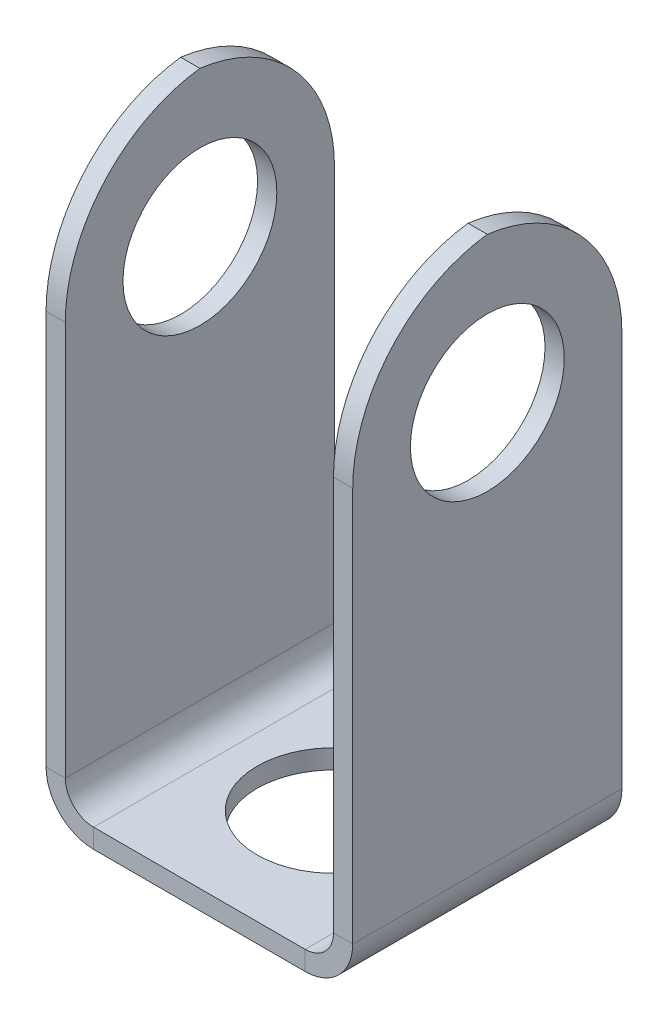
ISO-10303-21;
HEADER;
FILE_DESCRIPTION(('STEP AP214'),'2;1');
FILE_NAME('part.step','',(''),(''),'','','');
FILE_SCHEMA(('AUTOMOTIVE_DESIGN { 1 0 10303 214 1 1 1 1 }'));
ENDSEC;
DATA;
#1=APPLICATION_CONTEXT('core data for automotive mechanical design processes');
#2=APPLICATION_PROTOCOL_DEFINITION('international standard','automotive_design',2000,#1);
#3=PRODUCT_CONTEXT('',#1,'mechanical');
#4=PRODUCT('Part','Part','',(#3));
#5=PRODUCT_RELATED_PRODUCT_CATEGORY('part','',(#4));
#6=PRODUCT_DEFINITION_FORMATION('','',#4);
#7=PRODUCT_DEFINITION_CONTEXT('part definition',#1,'design');
#8=PRODUCT_DEFINITION('design','',#6,#7);
#9=PRODUCT_DEFINITION_SHAPE('','',#8);
#10=(LENGTH_UNIT() NAMED_UNIT(*) SI_UNIT(.MILLI.,.METRE.));
#11=(NAMED_UNIT(*) PLANE_ANGLE_UNIT() SI_UNIT($,.RADIAN.));
#12=(NAMED_UNIT(*) SI_UNIT($,.STERADIAN.) SOLID_ANGLE_UNIT());
#13=UNCERTAINTY_MEASURE_WITH_UNIT(LENGTH_MEASURE(1.E-05),#10,'distance_accuracy_value','');
#14=(GEOMETRIC_REPRESENTATION_CONTEXT(3) GLOBAL_UNCERTAINTY_ASSIGNED_CONTEXT((#13)) GLOBAL_UNIT_ASSIGNED_CONTEXT((#10,
#11,#12)) REPRESENTATION_CONTEXT('',''));
#15=CARTESIAN_POINT('',(0.,0.,0.));
#16=DIRECTION('',(0.,0.,1.));
#17=DIRECTION('',(1.,0.,0.));
#18=AXIS2_PLACEMENT_3D('',#15,#16,#17);
#19=CARTESIAN_POINT('',(-2.75,0.5,-3.5));
#20=DIRECTION('',(0.,0.,1.));
#21=DIRECTION('',(1.,0.,0.));
#22=AXIS2_PLACEMENT_3D('',#19,#20,#21);
#23=PLANE('',#22);
#24=DIRECTION('',(-1.,0.,0.));
#25=VECTOR('',#24,1.);
#26=CARTESIAN_POINT('',(-2.75,0.,-3.5));
#27=LINE('',#26,#25);
#28=CARTESIAN_POINT('',(2.75,0.,-3.5));
#29=VERTEX_POINT('',#28);
#30=CARTESIAN_POINT('',(-2.75,0.,-3.5));
#31=VERTEX_POINT('',#30);
#32=EDGE_CURVE('E278',#29,#31,#27,.T.);
#33=ORIENTED_EDGE('',*,*,#32,.T.);
#34=DIRECTION('',(0.,-1.,0.));
#35=VECTOR('',#34,1.);
#36=CARTESIAN_POINT('',(-2.75,0.5,-3.5));
#37=LINE('',#36,#35);
#38=CARTESIAN_POINT('',(-2.75,0.5,-3.5));
#39=VERTEX_POINT('',#38);
#40=EDGE_CURVE('E287',#39,#31,#37,.T.);
#41=ORIENTED_EDGE('',*,*,#40,.F.);
#42=DIRECTION('',(-1.,0.,0.));
#43=VECTOR('',#42,1.);
#44=CARTESIAN_POINT('',(-2.75,0.5,-3.5));
#45=LINE('',#44,#43);
#46=CARTESIAN_POINT('',(2.75,0.5,-3.5));
#47=VERTEX_POINT('',#46);
#48=EDGE_CURVE('E268',#47,#39,#45,.T.);
#49=ORIENTED_EDGE('',*,*,#48,.F.);
#50=DIRECTION('',(0.,-1.,0.));
#51=VECTOR('',#50,1.);
#52=CARTESIAN_POINT('',(2.75,0.5,-3.5));
#53=LINE('',#52,#51);
#54=EDGE_CURVE('E290',#47,#29,#53,.T.);
#55=ORIENTED_EDGE('',*,*,#54,.T.);
#56=EDGE_LOOP('',(#33,#41,#49,#55));
#57=FACE_BOUND('',#56,.T.);
#58=ADVANCED_FACE('F79',(#57),#23,.F.);
#59=CARTESIAN_POINT('',(-2.75,0.5,3.5));
#60=DIRECTION('',(0.,0.,-1.));
#61=DIRECTION('',(-1.,0.,0.));
#62=AXIS2_PLACEMENT_3D('',#59,#60,#61);
#63=PLANE('',#62);
#64=DIRECTION('',(1.,0.,0.));
#65=VECTOR('',#64,1.);
#66=CARTESIAN_POINT('',(-2.75,0.,3.5));
#67=LINE('',#66,#65);
#68=CARTESIAN_POINT('',(-2.75,0.,3.5));
#69=VERTEX_POINT('',#68);
#70=CARTESIAN_POINT('',(2.75,0.,3.5));
#71=VERTEX_POINT('',#70);
#72=EDGE_CURVE('E269',#69,#71,#67,.T.);
#73=ORIENTED_EDGE('',*,*,#72,.T.);
#74=DIRECTION('',(0.,-1.,0.));
#75=VECTOR('',#74,1.);
#76=CARTESIAN_POINT('',(2.75,0.5,3.5));
#77=LINE('',#76,#75);
#78=CARTESIAN_POINT('',(2.75,0.5,3.5));
#79=VERTEX_POINT('',#78);
#80=EDGE_CURVE('E275',#79,#71,#77,.T.);
#81=ORIENTED_EDGE('',*,*,#80,.F.);
#82=DIRECTION('',(1.,0.,0.));
#83=VECTOR('',#82,1.);
#84=CARTESIAN_POINT('',(-2.75,0.5,3.5));
#85=LINE('',#84,#83);
#86=CARTESIAN_POINT('',(-2.75,0.5,3.5));
#87=VERTEX_POINT('',#86);
#88=EDGE_CURVE('E273',#87,#79,#85,.T.);
#89=ORIENTED_EDGE('',*,*,#88,.F.);
#90=DIRECTION('',(0.,-1.,0.));
#91=VECTOR('',#90,1.);
#92=CARTESIAN_POINT('',(-2.75,0.5,3.5));
#93=LINE('',#92,#91);
#94=EDGE_CURVE('E284',#87,#69,#93,.T.);
#95=ORIENTED_EDGE('',*,*,#94,.T.);
#96=EDGE_LOOP('',(#73,#81,#89,#95));
#97=FACE_BOUND('',#96,.T.);
#98=ADVANCED_FACE('F365',(#97),#63,.F.);
#99=CARTESIAN_POINT('',(0.,0.5,0.));
#100=DIRECTION('',(0.,1.,0.));
#101=DIRECTION('',(0.,0.,1.));
#102=AXIS2_PLACEMENT_3D('',#99,#100,#101);
#103=PLANE('',#102);
#104=CARTESIAN_POINT('',(0.,0.5,0.));
#105=DIRECTION('',(0.,1.,0.));
#106=DIRECTION('',(0.,0.,1.));
#107=AXIS2_PLACEMENT_3D('',#104,#105,#106);
#108=CIRCLE('',#107,2.);
#109=CARTESIAN_POINT('',(0.,0.5,2.));
#110=VERTEX_POINT('',#109);
#111=EDGE_CURVE('E218',#110,#110,#108,.T.);
#112=ORIENTED_EDGE('',*,*,#111,.F.);
#113=EDGE_LOOP('',(#112));
#114=FACE_BOUND('',#113,.T.);
#115=DIRECTION('',(0.,0.,-1.));
#116=VECTOR('',#115,1.);
#117=CARTESIAN_POINT('',(2.75,0.5,-3.5));
#118=LINE('',#117,#116);
#119=EDGE_CURVE('E265',#79,#47,#118,.T.);
#120=ORIENTED_EDGE('',*,*,#119,.T.);
#121=ORIENTED_EDGE('',*,*,#48,.T.);
#122=DIRECTION('',(0.,0.,1.));
#123=VECTOR('',#122,1.);
#124=CARTESIAN_POINT('',(-2.75,0.5,-3.5));
#125=LINE('',#124,#123);
#126=EDGE_CURVE('E271',#39,#87,#125,.T.);
#127=ORIENTED_EDGE('',*,*,#126,.T.);
#128=ORIENTED_EDGE('',*,*,#88,.T.);
#129=EDGE_LOOP('',(#120,#121,#127,#128));
#130=FACE_BOUND('',#129,.T.);
#131=ADVANCED_FACE('F361',(#114,#130),#103,.T.);
#132=CARTESIAN_POINT('',(0.,0.,0.));
#133=DIRECTION('',(0.,1.,0.));
#134=DIRECTION('',(0.,0.,1.));
#135=AXIS2_PLACEMENT_3D('',#132,#133,#134);
#136=PLANE('',#135);
#137=CARTESIAN_POINT('',(0.,0.,0.));
#138=DIRECTION('',(0.,1.,0.));
#139=DIRECTION('',(0.,0.,1.));
#140=AXIS2_PLACEMENT_3D('',#137,#138,#139);
#141=CIRCLE('',#140,2.);
#142=CARTESIAN_POINT('',(0.,0.,2.));
#143=VERTEX_POINT('',#142);
#144=EDGE_CURVE('E317',#143,#143,#141,.T.);
#145=ORIENTED_EDGE('',*,*,#144,.T.);
#146=EDGE_LOOP('',(#145));
#147=FACE_BOUND('',#146,.T.);
#148=DIRECTION('',(0.,0.,-1.));
#149=VECTOR('',#148,1.);
#150=CARTESIAN_POINT('',(2.75,0.,-3.5));
#151=LINE('',#150,#149);
#152=EDGE_CURVE('E256',#71,#29,#151,.T.);
#153=ORIENTED_EDGE('',*,*,#152,.F.);
#154=ORIENTED_EDGE('',*,*,#72,.F.);
#155=DIRECTION('',(0.,0.,1.));
#156=VECTOR('',#155,1.);
#157=CARTESIAN_POINT('',(-2.75,0.,-3.5));
#158=LINE('',#157,#156);
#159=EDGE_CURVE('E191',#31,#69,#158,.T.);
#160=ORIENTED_EDGE('',*,*,#159,.F.);
#161=ORIENTED_EDGE('',*,*,#32,.F.);
#162=EDGE_LOOP('',(#153,#154,#160,#161));
#163=FACE_BOUND('',#162,.T.);
#164=ADVANCED_FACE('F407',(#147,#163),#136,.F.);
#165=CARTESIAN_POINT('',(2.75,1.2366,3.5));
#166=DIRECTION('',(0.,0.,1.));
#167=DIRECTION('',(1.,0.,0.));
#168=AXIS2_PLACEMENT_3D('',#165,#166,#167);
#169=PLANE('',#168);
#170=DIRECTION('',(-1.,0.,0.));
#171=VECTOR('',#170,1.);
#172=CARTESIAN_POINT('',(3.9866,1.2366,3.5));
#173=LINE('',#172,#171);
#174=CARTESIAN_POINT('',(3.4866,1.2366,3.5));
#175=VERTEX_POINT('',#174);
#176=CARTESIAN_POINT('',(3.9866,1.2366,3.5));
#177=VERTEX_POINT('',#176);
#178=EDGE_CURVE('E228',#175,#177,#173,.F.);
#179=ORIENTED_EDGE('',*,*,#178,.F.);
#180=CARTESIAN_POINT('',(2.75,1.2366,3.5));
#181=DIRECTION('',(0.,0.,-1.));
#182=DIRECTION('',(-1.,0.,0.));
#183=AXIS2_PLACEMENT_3D('',#180,#181,#182);
#184=CIRCLE('',#183,0.7366);
#185=EDGE_CURVE('E260',#79,#175,#184,.F.);
#186=ORIENTED_EDGE('',*,*,#185,.F.);
#187=ORIENTED_EDGE('',*,*,#80,.T.);
#188=CARTESIAN_POINT('',(2.75,1.2366,3.5));
#189=DIRECTION('',(0.,0.,-1.));
#190=DIRECTION('',(-1.,0.,0.));
#191=AXIS2_PLACEMENT_3D('',#188,#189,#190);
#192=CIRCLE('',#191,1.2366);
#193=EDGE_CURVE('E253',#71,#177,#192,.F.);
#194=ORIENTED_EDGE('',*,*,#193,.T.);
#195=EDGE_LOOP('',(#179,#186,#187,#194));
#196=FACE_BOUND('',#195,.T.);
#197=ADVANCED_FACE('F377',(#196),#169,.T.);
#198=CARTESIAN_POINT('',(2.75,1.2366,-3.5));
#199=DIRECTION('',(0.,0.,1.));
#200=DIRECTION('',(1.,0.,0.));
#201=AXIS2_PLACEMENT_3D('',#198,#199,#200);
#202=PLANE('',#201);
#203=CARTESIAN_POINT('',(2.75,1.2366,-3.5));
#204=DIRECTION('',(0.,0.,-1.));
#205=DIRECTION('',(-1.,0.,0.));
#206=AXIS2_PLACEMENT_3D('',#203,#204,#205);
#207=CIRCLE('',#206,0.7366);
#208=CARTESIAN_POINT('',(3.4866,1.2366,-3.5));
#209=VERTEX_POINT('',#208);
#210=EDGE_CURVE('E235',#209,#47,#207,.T.);
#211=ORIENTED_EDGE('',*,*,#210,.F.);
#212=DIRECTION('',(-1.,0.,0.));
#213=VECTOR('',#212,1.);
#214=CARTESIAN_POINT('',(3.4866,1.2366,-3.5));
#215=LINE('',#214,#213);
#216=CARTESIAN_POINT('',(3.9866,1.2366,-3.5));
#217=VERTEX_POINT('',#216);
#218=EDGE_CURVE('E246',#209,#217,#215,.F.);
#219=ORIENTED_EDGE('',*,*,#218,.T.);
#220=CARTESIAN_POINT('',(2.75,1.2366,-3.5));
#221=DIRECTION('',(0.,0.,-1.));
#222=DIRECTION('',(-1.,0.,0.));
#223=AXIS2_PLACEMENT_3D('',#220,#221,#222);
#224=CIRCLE('',#223,1.2366);
#225=EDGE_CURVE('E257',#217,#29,#224,.T.);
#226=ORIENTED_EDGE('',*,*,#225,.T.);
#227=ORIENTED_EDGE('',*,*,#54,.F.);
#228=EDGE_LOOP('',(#211,#219,#226,#227));
#229=FACE_BOUND('',#228,.T.);
#230=ADVANCED_FACE('F400',(#229),#202,.F.);
#231=CARTESIAN_POINT('',(2.75,1.2366,-3.5));
#232=DIRECTION('',(0.,0.,-1.));
#233=DIRECTION('',(1.,0.,0.));
#234=AXIS2_PLACEMENT_3D('',#231,#232,#233);
#235=CYLINDRICAL_SURFACE('',#234,1.2366);
#236=ORIENTED_EDGE('',*,*,#152,.T.);
#237=ORIENTED_EDGE('',*,*,#225,.F.);
#238=DIRECTION('',(0.,0.,-1.));
#239=VECTOR('',#238,1.);
#240=CARTESIAN_POINT('',(3.9866,1.2366,3.5));
#241=LINE('',#240,#239);
#242=EDGE_CURVE('E243',#217,#177,#241,.F.);
#243=ORIENTED_EDGE('',*,*,#242,.T.);
#244=ORIENTED_EDGE('',*,*,#193,.F.);
#245=EDGE_LOOP('',(#236,#237,#243,#244));
#246=FACE_BOUND('',#245,.T.);
#247=ADVANCED_FACE('F404',(#246),#235,.T.);
#248=CARTESIAN_POINT('',(2.75,1.2366,-3.5));
#249=DIRECTION('',(0.,0.,-1.));
#250=DIRECTION('',(1.,0.,0.));
#251=AXIS2_PLACEMENT_3D('',#248,#249,#250);
#252=CYLINDRICAL_SURFACE('',#251,0.7366);
#253=ORIENTED_EDGE('',*,*,#119,.F.);
#254=ORIENTED_EDGE('',*,*,#185,.T.);
#255=DIRECTION('',(0.,0.,-1.));
#256=VECTOR('',#255,1.);
#257=CARTESIAN_POINT('',(3.4866,1.2366,3.5));
#258=LINE('',#257,#256);
#259=EDGE_CURVE('E249',#175,#209,#258,.T.);
#260=ORIENTED_EDGE('',*,*,#259,.T.);
#261=ORIENTED_EDGE('',*,*,#210,.T.);
#262=EDGE_LOOP('',(#253,#254,#260,#261));
#263=FACE_BOUND('',#262,.T.);
#264=ADVANCED_FACE('F372',(#263),#252,.F.);
#265=CARTESIAN_POINT('',(3.9866,0.499999999999998,3.5));
#266=DIRECTION('',(0.,0.,-1.));
#267=DIRECTION('',(-1.,0.,0.));
#268=AXIS2_PLACEMENT_3D('',#265,#266,#267);
#269=PLANE('',#268);
#270=DIRECTION('',(0.,-1.,0.));
#271=VECTOR('',#270,1.);
#272=CARTESIAN_POINT('',(3.9866,0.,3.5));
#273=LINE('',#272,#271);
#274=CARTESIAN_POINT('',(3.98660000000004,11.5,3.5));
#275=VERTEX_POINT('',#274);
#276=EDGE_CURVE('E236',#275,#177,#273,.T.);
#277=ORIENTED_EDGE('',*,*,#276,.F.);
#278=DIRECTION('',(-1.,0.,0.));
#279=VECTOR('',#278,1.);
#280=CARTESIAN_POINT('',(3.98660000000004,11.5,3.5));
#281=LINE('',#280,#279);
#282=CARTESIAN_POINT('',(3.48660000000004,11.5,3.5));
#283=VERTEX_POINT('',#282);
#284=EDGE_CURVE('E88',#275,#283,#281,.T.);
#285=ORIENTED_EDGE('',*,*,#284,.T.);
#286=DIRECTION('',(0.,1.,0.));
#287=VECTOR('',#286,1.);
#288=CARTESIAN_POINT('',(3.4866,0.5,3.5));
#289=LINE('',#288,#287);
#290=EDGE_CURVE('E241',#283,#175,#289,.F.);
#291=ORIENTED_EDGE('',*,*,#290,.T.);
#292=ORIENTED_EDGE('',*,*,#178,.T.);
#293=EDGE_LOOP('',(#277,#285,#291,#292));
#294=FACE_BOUND('',#293,.T.);
#295=ADVANCED_FACE('F380',(#294),#269,.F.);
#296=CARTESIAN_POINT('',(3.98660000000005,15.5,-3.5));
#297=DIRECTION('',(0.,0.,1.));
#298=DIRECTION('',(1.,0.,0.));
#299=AXIS2_PLACEMENT_3D('',#296,#297,#298);
#300=PLANE('',#299);
#301=DIRECTION('',(0.,-1.,0.));
#302=VECTOR('',#301,1.);
#303=CARTESIAN_POINT('',(3.48660000000005,15.5,-3.5));
#304=LINE('',#303,#302);
#305=CARTESIAN_POINT('',(3.48660000000004,11.5,-3.5));
#306=VERTEX_POINT('',#305);
#307=EDGE_CURVE('E238',#209,#306,#304,.F.);
#308=ORIENTED_EDGE('',*,*,#307,.T.);
#309=DIRECTION('',(-1.,0.,0.));
#310=VECTOR('',#309,1.);
#311=CARTESIAN_POINT('',(3.98660000000004,11.5,-3.5));
#312=LINE('',#311,#310);
#313=CARTESIAN_POINT('',(3.98660000000004,11.5,-3.5));
#314=VERTEX_POINT('',#313);
#315=EDGE_CURVE('E296',#306,#314,#312,.F.);
#316=ORIENTED_EDGE('',*,*,#315,.T.);
#317=DIRECTION('',(0.,1.,0.));
#318=VECTOR('',#317,1.);
#319=CARTESIAN_POINT('',(3.9866,0.,-3.5));
#320=LINE('',#319,#318);
#321=EDGE_CURVE('E232',#217,#314,#320,.T.);
#322=ORIENTED_EDGE('',*,*,#321,.F.);
#323=ORIENTED_EDGE('',*,*,#218,.F.);
#324=EDGE_LOOP('',(#308,#316,#322,#323));
#325=FACE_BOUND('',#324,.T.);
#326=ADVANCED_FACE('F396',(#325),#300,.F.);
#327=CARTESIAN_POINT('',(3.9866,0.,0.));
#328=DIRECTION('',(-1.,0.,0.));
#329=DIRECTION('',(0.,-1.,0.));
#330=AXIS2_PLACEMENT_3D('',#327,#328,#329);
#331=PLANE('',#330);
#332=CARTESIAN_POINT('',(3.98660000000004,11.6780623769674,0.));
#333=DIRECTION('',(1.,0.,0.));
#334=DIRECTION('',(0.,1.,0.));
#335=AXIS2_PLACEMENT_3D('',#332,#333,#334);
#336=CIRCLE('',#335,2.);
#337=CARTESIAN_POINT('',(3.98660000000004,13.6780623769674,0.));
#338=VERTEX_POINT('',#337);
#339=EDGE_CURVE('E328',#338,#338,#336,.T.);
#340=ORIENTED_EDGE('',*,*,#339,.F.);
#341=EDGE_LOOP('',(#340));
#342=FACE_BOUND('',#341,.T.);
#343=ORIENTED_EDGE('',*,*,#321,.T.);
#344=CARTESIAN_POINT('',(3.98660000000004,11.5,0.500000000000002));
#345=DIRECTION('',(-1.,0.,0.));
#346=DIRECTION('',(0.,-1.,0.));
#347=AXIS2_PLACEMENT_3D('',#344,#345,#346);
#348=CIRCLE('',#347,4.);
#349=CARTESIAN_POINT('',(3.98660000000005,15.4686269665969,0.));
#350=VERTEX_POINT('',#349);
#351=EDGE_CURVE('E301',#314,#350,#348,.F.);
#352=ORIENTED_EDGE('',*,*,#351,.T.);
#353=CARTESIAN_POINT('',(3.98660000000004,11.5,-0.5));
#354=DIRECTION('',(-1.,0.,0.));
#355=DIRECTION('',(0.,-1.,0.));
#356=AXIS2_PLACEMENT_3D('',#353,#354,#355);
#357=CIRCLE('',#356,4.);
#358=EDGE_CURVE('E299',#350,#275,#357,.F.);
#359=ORIENTED_EDGE('',*,*,#358,.T.);
#360=ORIENTED_EDGE('',*,*,#276,.T.);
#361=ORIENTED_EDGE('',*,*,#242,.F.);
#362=EDGE_LOOP('',(#343,#352,#359,#360,#361));
#363=FACE_BOUND('',#362,.T.);
#364=ADVANCED_FACE('F402',(#342,#363),#331,.F.);
#365=CARTESIAN_POINT('',(3.4866,0.,0.));
#366=DIRECTION('',(-1.,0.,0.));
#367=DIRECTION('',(0.,-1.,0.));
#368=AXIS2_PLACEMENT_3D('',#365,#366,#367);
#369=PLANE('',#368);
#370=CARTESIAN_POINT('',(3.48660000000004,11.6780623769674,0.));
#371=DIRECTION('',(-1.,0.,0.));
#372=DIRECTION('',(0.,-1.,0.));
#373=AXIS2_PLACEMENT_3D('',#370,#371,#372);
#374=CIRCLE('',#373,2.);
#375=CARTESIAN_POINT('',(3.48660000000003,9.67806237696735,0.));
#376=VERTEX_POINT('',#375);
#377=EDGE_CURVE('E324',#376,#376,#374,.T.);
#378=ORIENTED_EDGE('',*,*,#377,.F.);
#379=EDGE_LOOP('',(#378));
#380=FACE_BOUND('',#379,.T.);
#381=CARTESIAN_POINT('',(3.48660000000004,11.5,-0.499999999999999));
#382=DIRECTION('',(-1.,0.,0.));
#383=DIRECTION('',(0.,-1.,0.));
#384=AXIS2_PLACEMENT_3D('',#381,#382,#383);
#385=CIRCLE('',#384,4.);
#386=CARTESIAN_POINT('',(3.48660000000005,15.4686269665969,0.));
#387=VERTEX_POINT('',#386);
#388=EDGE_CURVE('E292',#283,#387,#385,.T.);
#389=ORIENTED_EDGE('',*,*,#388,.T.);
#390=CARTESIAN_POINT('',(3.48660000000004,11.5,0.500000000000002));
#391=DIRECTION('',(-1.,0.,0.));
#392=DIRECTION('',(0.,-1.,0.));
#393=AXIS2_PLACEMENT_3D('',#390,#391,#392);
#394=CIRCLE('',#393,4.);
#395=EDGE_CURVE('E294',#387,#306,#394,.T.);
#396=ORIENTED_EDGE('',*,*,#395,.T.);
#397=ORIENTED_EDGE('',*,*,#307,.F.);
#398=ORIENTED_EDGE('',*,*,#259,.F.);
#399=ORIENTED_EDGE('',*,*,#290,.F.);
#400=EDGE_LOOP('',(#389,#396,#397,#398,#399));
#401=FACE_BOUND('',#400,.T.);
#402=ADVANCED_FACE('F385',(#380,#401),#369,.T.);
#403=CARTESIAN_POINT('',(-2.75,1.2366,-3.5));
#404=DIRECTION('',(0.,0.,-1.));
#405=DIRECTION('',(0.,1.,0.));
#406=AXIS2_PLACEMENT_3D('',#403,#404,#405);
#407=PLANE('',#406);
#408=DIRECTION('',(1.,0.,0.));
#409=VECTOR('',#408,1.);
#410=CARTESIAN_POINT('',(-3.9866,1.2366,-3.5));
#411=LINE('',#410,#409);
#412=CARTESIAN_POINT('',(-3.4866,1.2366,-3.5));
#413=VERTEX_POINT('',#412);
#414=CARTESIAN_POINT('',(-3.9866,1.2366,-3.5));
#415=VERTEX_POINT('',#414);
#416=EDGE_CURVE('E224',#413,#415,#411,.F.);
#417=ORIENTED_EDGE('',*,*,#416,.F.);
#418=CARTESIAN_POINT('',(-2.75,1.2366,-3.5));
#419=DIRECTION('',(0.,0.,1.));
#420=DIRECTION('',(0.,-1.,0.));
#421=AXIS2_PLACEMENT_3D('',#418,#419,#420);
#422=CIRCLE('',#421,0.7366);
#423=EDGE_CURVE('E195',#39,#413,#422,.F.);
#424=ORIENTED_EDGE('',*,*,#423,.F.);
#425=ORIENTED_EDGE('',*,*,#40,.T.);
#426=CARTESIAN_POINT('',(-2.75,1.2366,-3.5));
#427=DIRECTION('',(0.,0.,1.));
#428=DIRECTION('',(0.,-1.,0.));
#429=AXIS2_PLACEMENT_3D('',#426,#427,#428);
#430=CIRCLE('',#429,1.2366);
#431=EDGE_CURVE('E194',#31,#415,#430,.F.);
#432=ORIENTED_EDGE('',*,*,#431,.T.);
#433=EDGE_LOOP('',(#417,#424,#425,#432));
#434=FACE_BOUND('',#433,.T.);
#435=ADVANCED_FACE('F355',(#434),#407,.T.);
#436=CARTESIAN_POINT('',(-2.75,1.2366,3.5));
#437=DIRECTION('',(0.,0.,-1.));
#438=DIRECTION('',(0.,1.,0.));
#439=AXIS2_PLACEMENT_3D('',#436,#437,#438);
#440=PLANE('',#439);
#441=CARTESIAN_POINT('',(-2.75,1.2366,3.5));
#442=DIRECTION('',(0.,0.,1.));
#443=DIRECTION('',(0.,-1.,0.));
#444=AXIS2_PLACEMENT_3D('',#441,#442,#443);
#445=CIRCLE('',#444,0.7366);
#446=CARTESIAN_POINT('',(-3.4866,1.2366,3.5));
#447=VERTEX_POINT('',#446);
#448=EDGE_CURVE('E202',#447,#87,#445,.T.);
#449=ORIENTED_EDGE('',*,*,#448,.F.);
#450=DIRECTION('',(1.,0.,0.));
#451=VECTOR('',#450,1.);
#452=CARTESIAN_POINT('',(-3.4866,1.2366,3.5));
#453=LINE('',#452,#451);
#454=CARTESIAN_POINT('',(-3.9866,1.23659999999999,3.5));
#455=VERTEX_POINT('',#454);
#456=EDGE_CURVE('E199',#447,#455,#453,.F.);
#457=ORIENTED_EDGE('',*,*,#456,.T.);
#458=CARTESIAN_POINT('',(-2.75,1.2366,3.5));
#459=DIRECTION('',(0.,0.,1.));
#460=DIRECTION('',(0.,-1.,0.));
#461=AXIS2_PLACEMENT_3D('',#458,#459,#460);
#462=CIRCLE('',#461,1.2366);
#463=EDGE_CURVE('E183',#455,#69,#462,.T.);
#464=ORIENTED_EDGE('',*,*,#463,.T.);
#465=ORIENTED_EDGE('',*,*,#94,.F.);
#466=EDGE_LOOP('',(#449,#457,#464,#465));
#467=FACE_BOUND('',#466,.T.);
#468=ADVANCED_FACE('F200',(#467),#440,.F.);
#469=CARTESIAN_POINT('',(-2.75,1.2366,3.5));
#470=DIRECTION('',(0.,0.,1.));
#471=DIRECTION('',(-1.,0.,0.));
#472=AXIS2_PLACEMENT_3D('',#469,#470,#471);
#473=CYLINDRICAL_SURFACE('',#472,1.2366);
#474=ORIENTED_EDGE('',*,*,#159,.T.);
#475=ORIENTED_EDGE('',*,*,#463,.F.);
#476=DIRECTION('',(0.,0.,1.));
#477=VECTOR('',#476,1.);
#478=CARTESIAN_POINT('',(-3.9866,1.2366,-3.5));
#479=LINE('',#478,#477);
#480=EDGE_CURVE('E188',#455,#415,#479,.F.);
#481=ORIENTED_EDGE('',*,*,#480,.T.);
#482=ORIENTED_EDGE('',*,*,#431,.F.);
#483=EDGE_LOOP('',(#474,#475,#481,#482));
#484=FACE_BOUND('',#483,.T.);
#485=ADVANCED_FACE('F185',(#484),#473,.T.);
#486=CARTESIAN_POINT('',(-2.75,1.2366,3.5));
#487=DIRECTION('',(0.,0.,1.));
#488=DIRECTION('',(-1.,0.,0.));
#489=AXIS2_PLACEMENT_3D('',#486,#487,#488);
#490=CYLINDRICAL_SURFACE('',#489,0.7366);
#491=ORIENTED_EDGE('',*,*,#126,.F.);
#492=ORIENTED_EDGE('',*,*,#423,.T.);
#493=DIRECTION('',(0.,0.,1.));
#494=VECTOR('',#493,1.);
#495=CARTESIAN_POINT('',(-3.4866,1.2366,-3.5));
#496=LINE('',#495,#494);
#497=EDGE_CURVE('E204',#413,#447,#496,.T.);
#498=ORIENTED_EDGE('',*,*,#497,.T.);
#499=ORIENTED_EDGE('',*,*,#448,.T.);
#500=EDGE_LOOP('',(#491,#492,#498,#499));
#501=FACE_BOUND('',#500,.T.);
#502=ADVANCED_FACE('F358',(#501),#490,.F.);
#503=CARTESIAN_POINT('',(-3.9866,0.499999999999998,-3.5));
#504=DIRECTION('',(0.,0.,1.));
#505=DIRECTION('',(1.,0.,0.));
#506=AXIS2_PLACEMENT_3D('',#503,#504,#505);
#507=PLANE('',#506);
#508=DIRECTION('',(0.,-1.,0.));
#509=VECTOR('',#508,1.);
#510=CARTESIAN_POINT('',(-3.9866,0.,-3.5));
#511=LINE('',#510,#509);
#512=CARTESIAN_POINT('',(-3.98660000000004,11.5,-3.5));
#513=VERTEX_POINT('',#512);
#514=EDGE_CURVE('E209',#513,#415,#511,.T.);
#515=ORIENTED_EDGE('',*,*,#514,.F.);
#516=DIRECTION('',(1.,0.,0.));
#517=VECTOR('',#516,1.);
#518=CARTESIAN_POINT('',(-3.98660000000004,11.5,-3.5));
#519=LINE('',#518,#517);
#520=CARTESIAN_POINT('',(-3.48660000000003,11.5,-3.5));
#521=VERTEX_POINT('',#520);
#522=EDGE_CURVE('E303',#513,#521,#519,.T.);
#523=ORIENTED_EDGE('',*,*,#522,.T.);
#524=DIRECTION('',(0.,1.,0.));
#525=VECTOR('',#524,1.);
#526=CARTESIAN_POINT('',(-3.4866,0.5,-3.5));
#527=LINE('',#526,#525);
#528=EDGE_CURVE('E210',#521,#413,#527,.F.);
#529=ORIENTED_EDGE('',*,*,#528,.T.);
#530=ORIENTED_EDGE('',*,*,#416,.T.);
#531=EDGE_LOOP('',(#515,#523,#529,#530));
#532=FACE_BOUND('',#531,.T.);
#533=ADVANCED_FACE('F351',(#532),#507,.F.);
#534=CARTESIAN_POINT('',(-3.98660000000005,15.5,3.5));
#535=DIRECTION('',(0.,0.,-1.));
#536=DIRECTION('',(-1.,0.,0.));
#537=AXIS2_PLACEMENT_3D('',#534,#535,#536);
#538=PLANE('',#537);
#539=DIRECTION('',(0.,-1.,0.));
#540=VECTOR('',#539,1.);
#541=CARTESIAN_POINT('',(-3.48660000000005,15.5,3.5));
#542=LINE('',#541,#540);
#543=CARTESIAN_POINT('',(-3.48660000000003,11.5,3.5));
#544=VERTEX_POINT('',#543);
#545=EDGE_CURVE('E215',#447,#544,#542,.F.);
#546=ORIENTED_EDGE('',*,*,#545,.T.);
#547=DIRECTION('',(1.,0.,0.));
#548=VECTOR('',#547,1.);
#549=CARTESIAN_POINT('',(-3.98660000000003,11.5,3.5));
#550=LINE('',#549,#548);
#551=CARTESIAN_POINT('',(-3.98660000000003,11.5,3.5));
#552=VERTEX_POINT('',#551);
#553=EDGE_CURVE('E13',#544,#552,#550,.F.);
#554=ORIENTED_EDGE('',*,*,#553,.T.);
#555=DIRECTION('',(0.,1.,0.));
#556=VECTOR('',#555,1.);
#557=CARTESIAN_POINT('',(-3.98659999999999,0.,3.5));
#558=LINE('',#557,#556);
#559=EDGE_CURVE('E207',#455,#552,#558,.T.);
#560=ORIENTED_EDGE('',*,*,#559,.F.);
#561=ORIENTED_EDGE('',*,*,#456,.F.);
#562=EDGE_LOOP('',(#546,#554,#560,#561));
#563=FACE_BOUND('',#562,.T.);
#564=ADVANCED_FACE('F212',(#563),#538,.F.);
#565=CARTESIAN_POINT('',(-3.98659999999999,0.,0.));
#566=DIRECTION('',(1.,0.,0.));
#567=DIRECTION('',(0.,1.,0.));
#568=AXIS2_PLACEMENT_3D('',#565,#566,#567);
#569=PLANE('',#568);
#570=CARTESIAN_POINT('',(-3.98660000000006,11.6780623769674,0.));
#571=DIRECTION('',(1.,0.,0.));
#572=DIRECTION('',(0.,1.,0.));
#573=AXIS2_PLACEMENT_3D('',#570,#571,#572);
#574=CIRCLE('',#573,2.);
#575=CARTESIAN_POINT('',(-3.98660000000006,13.6780623769674,0.));
#576=VERTEX_POINT('',#575);
#577=EDGE_CURVE('E331',#576,#576,#574,.T.);
#578=ORIENTED_EDGE('',*,*,#577,.T.);
#579=EDGE_LOOP('',(#578));
#580=FACE_BOUND('',#579,.T.);
#581=CARTESIAN_POINT('',(-3.98660000000003,11.5,-0.500000000000001));
#582=DIRECTION('',(1.,0.,0.));
#583=DIRECTION('',(0.,1.,0.));
#584=AXIS2_PLACEMENT_3D('',#581,#582,#583);
#585=CIRCLE('',#584,4.);
#586=CARTESIAN_POINT('',(-3.98660000000005,15.4686269665969,0.));
#587=VERTEX_POINT('',#586);
#588=EDGE_CURVE('E96',#552,#587,#585,.F.);
#589=ORIENTED_EDGE('',*,*,#588,.T.);
#590=CARTESIAN_POINT('',(-3.98660000000003,11.5,0.5));
#591=DIRECTION('',(1.,0.,0.));
#592=DIRECTION('',(0.,1.,0.));
#593=AXIS2_PLACEMENT_3D('',#590,#591,#592);
#594=CIRCLE('',#593,4.);
#595=EDGE_CURVE('E311',#587,#513,#594,.F.);
#596=ORIENTED_EDGE('',*,*,#595,.T.);
#597=ORIENTED_EDGE('',*,*,#514,.T.);
#598=ORIENTED_EDGE('',*,*,#480,.F.);
#599=ORIENTED_EDGE('',*,*,#559,.T.);
#600=EDGE_LOOP('',(#589,#596,#597,#598,#599));
#601=FACE_BOUND('',#600,.T.);
#602=ADVANCED_FACE('F206',(#580,#601),#569,.F.);
#603=CARTESIAN_POINT('',(-3.48659999999999,0.,0.));
#604=DIRECTION('',(1.,0.,0.));
#605=DIRECTION('',(0.,1.,0.));
#606=AXIS2_PLACEMENT_3D('',#603,#604,#605);
#607=PLANE('',#606);
#608=CARTESIAN_POINT('',(-3.48660000000003,11.6780623769674,0.));
#609=DIRECTION('',(1.,0.,0.));
#610=DIRECTION('',(0.,1.,0.));
#611=AXIS2_PLACEMENT_3D('',#608,#609,#610);
#612=CIRCLE('',#611,2.);
#613=CARTESIAN_POINT('',(-3.48660000000004,13.6780623769674,0.));
#614=VERTEX_POINT('',#613);
#615=EDGE_CURVE('E83',#614,#614,#612,.T.);
#616=ORIENTED_EDGE('',*,*,#615,.F.);
#617=EDGE_LOOP('',(#616));
#618=FACE_BOUND('',#617,.T.);
#619=ORIENTED_EDGE('',*,*,#528,.F.);
#620=CARTESIAN_POINT('',(-3.48660000000003,11.5,0.5));
#621=DIRECTION('',(1.,0.,0.));
#622=DIRECTION('',(0.,1.,0.));
#623=AXIS2_PLACEMENT_3D('',#620,#621,#622);
#624=CIRCLE('',#623,4.);
#625=CARTESIAN_POINT('',(-3.48660000000005,15.4686269665969,0.));
#626=VERTEX_POINT('',#625);
#627=EDGE_CURVE('E308',#521,#626,#624,.T.);
#628=ORIENTED_EDGE('',*,*,#627,.T.);
#629=CARTESIAN_POINT('',(-3.48660000000003,11.5,-0.500000000000001));
#630=DIRECTION('',(1.,0.,0.));
#631=DIRECTION('',(0.,1.,0.));
#632=AXIS2_PLACEMENT_3D('',#629,#630,#631);
#633=CIRCLE('',#632,4.);
#634=EDGE_CURVE('E306',#626,#544,#633,.T.);
#635=ORIENTED_EDGE('',*,*,#634,.T.);
#636=ORIENTED_EDGE('',*,*,#545,.F.);
#637=ORIENTED_EDGE('',*,*,#497,.F.);
#638=EDGE_LOOP('',(#619,#628,#635,#636,#637));
#639=FACE_BOUND('',#638,.T.);
#640=ADVANCED_FACE('F341',(#618,#639),#607,.T.);
#641=CARTESIAN_POINT('',(3.98660000000004,11.5,-0.5));
#642=DIRECTION('',(-1.,0.,0.));
#643=DIRECTION('',(0.,-1.,0.));
#644=AXIS2_PLACEMENT_3D('',#641,#642,#643);
#645=CYLINDRICAL_SURFACE('',#644,4.);
#646=ORIENTED_EDGE('',*,*,#284,.F.);
#647=ORIENTED_EDGE('',*,*,#358,.F.);
#648=DIRECTION('',(-1.,0.,0.));
#649=VECTOR('',#648,1.);
#650=CARTESIAN_POINT('',(3.73660000000005,15.4686269665969,0.));
#651=LINE('',#650,#649);
#652=EDGE_CURVE('E227',#387,#350,#651,.F.);
#653=ORIENTED_EDGE('',*,*,#652,.F.);
#654=ORIENTED_EDGE('',*,*,#388,.F.);
#655=EDGE_LOOP('',(#646,#647,#653,#654));
#656=FACE_BOUND('',#655,.T.);
#657=ADVANCED_FACE('F344',(#656),#645,.T.);
#658=CARTESIAN_POINT('',(3.98660000000004,11.5,0.500000000000002));
#659=DIRECTION('',(-1.,0.,0.));
#660=DIRECTION('',(0.,-1.,0.));
#661=AXIS2_PLACEMENT_3D('',#658,#659,#660);
#662=CYLINDRICAL_SURFACE('',#661,4.);
#663=ORIENTED_EDGE('',*,*,#351,.F.);
#664=ORIENTED_EDGE('',*,*,#315,.F.);
#665=ORIENTED_EDGE('',*,*,#395,.F.);
#666=ORIENTED_EDGE('',*,*,#652,.T.);
#667=EDGE_LOOP('',(#663,#664,#665,#666));
#668=FACE_BOUND('',#667,.T.);
#669=ADVANCED_FACE('F393',(#668),#662,.T.);
#670=CARTESIAN_POINT('',(-3.98660000000003,11.5,-0.500000000000001));
#671=DIRECTION('',(1.,0.,0.));
#672=DIRECTION('',(0.,1.,0.));
#673=AXIS2_PLACEMENT_3D('',#670,#671,#672);
#674=CYLINDRICAL_SURFACE('',#673,4.);
#675=DIRECTION('',(1.,0.,0.));
#676=VECTOR('',#675,1.);
#677=CARTESIAN_POINT('',(-3.73660000000005,15.4686269665969,0.));
#678=LINE('',#677,#676);
#679=EDGE_CURVE('E315',#587,#626,#678,.T.);
#680=ORIENTED_EDGE('',*,*,#679,.F.);
#681=ORIENTED_EDGE('',*,*,#588,.F.);
#682=ORIENTED_EDGE('',*,*,#553,.F.);
#683=ORIENTED_EDGE('',*,*,#634,.F.);
#684=EDGE_LOOP('',(#680,#681,#682,#683));
#685=FACE_BOUND('',#684,.T.);
#686=ADVANCED_FACE('F81',(#685),#674,.T.);
#687=CARTESIAN_POINT('',(-3.98660000000003,11.5,0.5));
#688=DIRECTION('',(1.,0.,0.));
#689=DIRECTION('',(0.,1.,0.));
#690=AXIS2_PLACEMENT_3D('',#687,#688,#689);
#691=CYLINDRICAL_SURFACE('',#690,4.);
#692=ORIENTED_EDGE('',*,*,#595,.F.);
#693=ORIENTED_EDGE('',*,*,#679,.T.);
#694=ORIENTED_EDGE('',*,*,#627,.F.);
#695=ORIENTED_EDGE('',*,*,#522,.F.);
#696=EDGE_LOOP('',(#692,#693,#694,#695));
#697=FACE_BOUND('',#696,.T.);
#698=ADVANCED_FACE('F420',(#697),#691,.T.);
#699=CARTESIAN_POINT('',(0.,0.,0.));
#700=DIRECTION('',(0.,1.,0.));
#701=DIRECTION('',(0.,0.,1.));
#702=AXIS2_PLACEMENT_3D('',#699,#700,#701);
#703=CYLINDRICAL_SURFACE('',#702,2.);
#704=ORIENTED_EDGE('',*,*,#144,.F.);
#705=EDGE_LOOP('',(#704));
#706=FACE_BOUND('',#705,.T.);
#707=ORIENTED_EDGE('',*,*,#111,.T.);
#708=EDGE_LOOP('',(#707));
#709=FACE_BOUND('',#708,.T.);
#710=ADVANCED_FACE('F422',(#706,#709),#703,.F.);
#711=CARTESIAN_POINT('',(-3.98660000000006,11.6780623769674,0.));
#712=DIRECTION('',(1.,0.,0.));
#713=DIRECTION('',(0.,1.,0.));
#714=AXIS2_PLACEMENT_3D('',#711,#712,#713);
#715=CYLINDRICAL_SURFACE('',#714,2.);
#716=ORIENTED_EDGE('',*,*,#615,.T.);
#717=EDGE_LOOP('',(#716));
#718=FACE_BOUND('',#717,.T.);
#719=ORIENTED_EDGE('',*,*,#577,.F.);
#720=EDGE_LOOP('',(#719));
#721=FACE_BOUND('',#720,.T.);
#722=ADVANCED_FACE('F338',(#718,#721),#715,.F.);
#723=ORIENTED_EDGE('',*,*,#377,.T.);
#724=EDGE_LOOP('',(#723));
#725=FACE_BOUND('',#724,.T.);
#726=ORIENTED_EDGE('',*,*,#339,.T.);
#727=EDGE_LOOP('',(#726));
#728=FACE_BOUND('',#727,.T.);
#729=ADVANCED_FACE('F649',(#725,#728),#715,.F.);
#730=CLOSED_SHELL('',(#58,#98,#131,#164,#197,#230,#247,#264,#295,#326,#364,#402,#435,#468,#485,
#502,#533,#564,#602,#640,#657,#669,#686,#698,#710,#722,#729));
#731=MANIFOLD_SOLID_BREP('B2',#730);
#732=ADVANCED_BREP_SHAPE_REPRESENTATION('',(#18,#731),#14);
#733=SHAPE_DEFINITION_REPRESENTATION(#9,#732);
ENDSEC;
END-ISO-10303-21;
